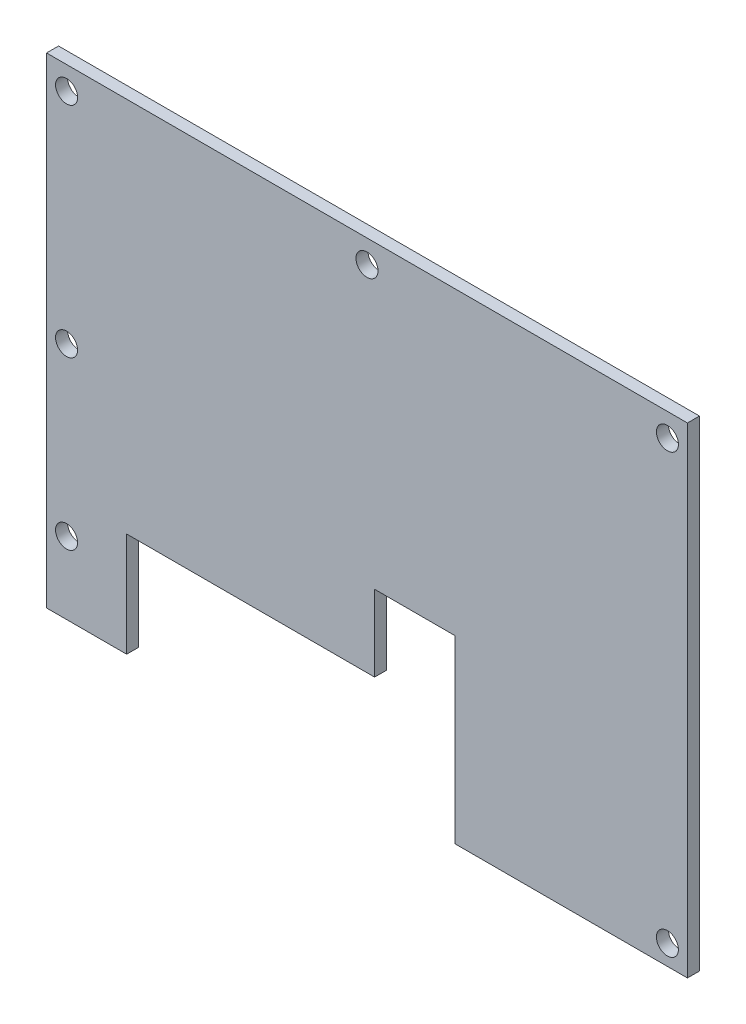
ISO-10303-21;
HEADER;
FILE_DESCRIPTION(('STEP AP214'),'2;1');
FILE_NAME('part.step','',(''),(''),'','','');
FILE_SCHEMA(('AUTOMOTIVE_DESIGN { 1 0 10303 214 1 1 1 1 }'));
ENDSEC;
DATA;
#1=APPLICATION_CONTEXT('core data for automotive mechanical design processes');
#2=APPLICATION_PROTOCOL_DEFINITION('international standard','automotive_design',2000,#1);
#3=PRODUCT_CONTEXT('',#1,'mechanical');
#4=PRODUCT('Part','Part','',(#3));
#5=PRODUCT_RELATED_PRODUCT_CATEGORY('part','',(#4));
#6=PRODUCT_DEFINITION_FORMATION('','',#4);
#7=PRODUCT_DEFINITION_CONTEXT('part definition',#1,'design');
#8=PRODUCT_DEFINITION('design','',#6,#7);
#9=PRODUCT_DEFINITION_SHAPE('','',#8);
#10=(LENGTH_UNIT() NAMED_UNIT(*) SI_UNIT(.MILLI.,.METRE.));
#11=(NAMED_UNIT(*) PLANE_ANGLE_UNIT() SI_UNIT($,.RADIAN.));
#12=(NAMED_UNIT(*) SI_UNIT($,.STERADIAN.) SOLID_ANGLE_UNIT());
#13=UNCERTAINTY_MEASURE_WITH_UNIT(LENGTH_MEASURE(1.E-05),#10,'distance_accuracy_value','');
#14=(GEOMETRIC_REPRESENTATION_CONTEXT(3) GLOBAL_UNCERTAINTY_ASSIGNED_CONTEXT((#13)) GLOBAL_UNIT_ASSIGNED_CONTEXT((#10,
#11,#12)) REPRESENTATION_CONTEXT('',''));
#15=CARTESIAN_POINT('',(0.,0.,0.));
#16=DIRECTION('',(0.,0.,1.));
#17=DIRECTION('',(1.,0.,0.));
#18=AXIS2_PLACEMENT_3D('',#15,#16,#17);
#19=CARTESIAN_POINT('',(0.,0.,0.));
#20=DIRECTION('',(0.,0.,-1.));
#21=DIRECTION('',(-1.,0.,0.));
#22=AXIS2_PLACEMENT_3D('',#19,#20,#21);
#23=PLANE('',#22);
#24=CARTESIAN_POINT('',(5.00000000000001,18.,0.));
#25=DIRECTION('',(0.,0.,1.));
#26=DIRECTION('',(1.,0.,0.));
#27=AXIS2_PLACEMENT_3D('',#24,#25,#26);
#28=CIRCLE('',#27,2.75);
#29=CARTESIAN_POINT('',(7.75000000000001,18.,0.));
#30=VERTEX_POINT('',#29);
#31=EDGE_CURVE('E145',#30,#30,#28,.T.);
#32=ORIENTED_EDGE('',*,*,#31,.T.);
#33=EDGE_LOOP('',(#32));
#34=FACE_BOUND('',#33,.T.);
#35=DIRECTION('',(-1.,0.,0.));
#36=VECTOR('',#35,1.);
#37=CARTESIAN_POINT('',(0.,26.,0.));
#38=LINE('',#37,#36);
#39=CARTESIAN_POINT('',(81.9,26.,0.));
#40=VERTEX_POINT('',#39);
#41=CARTESIAN_POINT('',(20.,26.,0.));
#42=VERTEX_POINT('',#41);
#43=EDGE_CURVE('E47',#40,#42,#38,.T.);
#44=ORIENTED_EDGE('',*,*,#43,.T.);
#45=DIRECTION('',(0.,-1.,0.));
#46=VECTOR('',#45,1.);
#47=CARTESIAN_POINT('',(20.,0.,0.));
#48=LINE('',#47,#46);
#49=CARTESIAN_POINT('',(20.,0.,0.));
#50=VERTEX_POINT('',#49);
#51=EDGE_CURVE('E11',#42,#50,#48,.T.);
#52=ORIENTED_EDGE('',*,*,#51,.T.);
#53=DIRECTION('',(1.,0.,0.));
#54=VECTOR('',#53,1.);
#55=CARTESIAN_POINT('',(0.,0.,0.));
#56=LINE('',#55,#54);
#57=CARTESIAN_POINT('',(0.,0.,0.));
#58=VERTEX_POINT('',#57);
#59=EDGE_CURVE('E164',#58,#50,#56,.T.);
#60=ORIENTED_EDGE('',*,*,#59,.F.);
#61=DIRECTION('',(0.,-1.,0.));
#62=VECTOR('',#61,1.);
#63=CARTESIAN_POINT('',(0.,0.,0.));
#64=LINE('',#63,#62);
#65=CARTESIAN_POINT('',(0.,120.,0.));
#66=VERTEX_POINT('',#65);
#67=EDGE_CURVE('E159',#66,#58,#64,.T.);
#68=ORIENTED_EDGE('',*,*,#67,.F.);
#69=DIRECTION('',(-1.,0.,0.));
#70=VECTOR('',#69,1.);
#71=CARTESIAN_POINT('',(0.,120.,0.));
#72=LINE('',#71,#70);
#73=CARTESIAN_POINT('',(160.,120.,0.));
#74=VERTEX_POINT('',#73);
#75=EDGE_CURVE('E84',#74,#66,#72,.T.);
#76=ORIENTED_EDGE('',*,*,#75,.F.);
#77=DIRECTION('',(0.,1.,0.));
#78=VECTOR('',#77,1.);
#79=CARTESIAN_POINT('',(160.,0.,0.));
#80=LINE('',#79,#78);
#81=CARTESIAN_POINT('',(160.,0.,0.));
#82=VERTEX_POINT('',#81);
#83=EDGE_CURVE('E167',#82,#74,#80,.T.);
#84=ORIENTED_EDGE('',*,*,#83,.F.);
#85=CARTESIAN_POINT('',(102.,0.,0.));
#86=VERTEX_POINT('',#85);
#87=EDGE_CURVE('E162',#86,#82,#56,.T.);
#88=ORIENTED_EDGE('',*,*,#87,.F.);
#89=DIRECTION('',(0.,-1.,0.));
#90=VECTOR('',#89,1.);
#91=CARTESIAN_POINT('',(102.,0.,0.));
#92=LINE('',#91,#90);
#93=CARTESIAN_POINT('',(102.,45.,0.));
#94=VERTEX_POINT('',#93);
#95=EDGE_CURVE('E131',#94,#86,#92,.T.);
#96=ORIENTED_EDGE('',*,*,#95,.F.);
#97=DIRECTION('',(-1.,0.,0.));
#98=VECTOR('',#97,1.);
#99=CARTESIAN_POINT('',(0.,45.,0.));
#100=LINE('',#99,#98);
#101=CARTESIAN_POINT('',(81.9,45.,0.));
#102=VERTEX_POINT('',#101);
#103=EDGE_CURVE('E177',#94,#102,#100,.T.);
#104=ORIENTED_EDGE('',*,*,#103,.T.);
#105=DIRECTION('',(0.,-1.,0.));
#106=VECTOR('',#105,1.);
#107=CARTESIAN_POINT('',(81.9,0.,0.));
#108=LINE('',#107,#106);
#109=EDGE_CURVE('E180',#102,#40,#108,.T.);
#110=ORIENTED_EDGE('',*,*,#109,.T.);
#111=EDGE_LOOP('',(#44,#52,#60,#68,#76,#84,#88,#96,#104,#110));
#112=FACE_BOUND('',#111,.T.);
#113=CARTESIAN_POINT('',(5.00000000000001,59.615,0.));
#114=DIRECTION('',(0.,0.,1.));
#115=DIRECTION('',(1.,0.,0.));
#116=AXIS2_PLACEMENT_3D('',#113,#114,#115);
#117=CIRCLE('',#116,2.75);
#118=CARTESIAN_POINT('',(7.75000000000001,59.615,0.));
#119=VERTEX_POINT('',#118);
#120=EDGE_CURVE('E406',#119,#119,#117,.T.);
#121=ORIENTED_EDGE('',*,*,#120,.T.);
#122=EDGE_LOOP('',(#121));
#123=FACE_BOUND('',#122,.T.);
#124=CARTESIAN_POINT('',(80.,114.23,0.));
#125=DIRECTION('',(0.,0.,1.));
#126=DIRECTION('',(1.,0.,0.));
#127=AXIS2_PLACEMENT_3D('',#124,#125,#126);
#128=CIRCLE('',#127,2.75);
#129=CARTESIAN_POINT('',(82.75,114.23,0.));
#130=VERTEX_POINT('',#129);
#131=EDGE_CURVE('E400',#130,#130,#128,.T.);
#132=ORIENTED_EDGE('',*,*,#131,.T.);
#133=EDGE_LOOP('',(#132));
#134=FACE_BOUND('',#133,.T.);
#135=CARTESIAN_POINT('',(155.,114.23,0.));
#136=DIRECTION('',(0.,0.,1.));
#137=DIRECTION('',(1.,0.,0.));
#138=AXIS2_PLACEMENT_3D('',#135,#136,#137);
#139=CIRCLE('',#138,2.75);
#140=CARTESIAN_POINT('',(157.75,114.23,0.));
#141=VERTEX_POINT('',#140);
#142=EDGE_CURVE('E394',#141,#141,#139,.T.);
#143=ORIENTED_EDGE('',*,*,#142,.T.);
#144=EDGE_LOOP('',(#143));
#145=FACE_BOUND('',#144,.T.);
#146=CARTESIAN_POINT('',(155.,5.,0.));
#147=DIRECTION('',(0.,0.,1.));
#148=DIRECTION('',(1.,0.,0.));
#149=AXIS2_PLACEMENT_3D('',#146,#147,#148);
#150=CIRCLE('',#149,2.75);
#151=CARTESIAN_POINT('',(157.75,5.,0.));
#152=VERTEX_POINT('',#151);
#153=EDGE_CURVE('E388',#152,#152,#150,.T.);
#154=ORIENTED_EDGE('',*,*,#153,.T.);
#155=EDGE_LOOP('',(#154));
#156=FACE_BOUND('',#155,.T.);
#157=CARTESIAN_POINT('',(5.,114.23,0.));
#158=DIRECTION('',(0.,0.,1.));
#159=DIRECTION('',(1.,0.,0.));
#160=AXIS2_PLACEMENT_3D('',#157,#158,#159);
#161=CIRCLE('',#160,2.75);
#162=CARTESIAN_POINT('',(7.75,114.23,0.));
#163=VERTEX_POINT('',#162);
#164=EDGE_CURVE('E378',#163,#163,#161,.T.);
#165=ORIENTED_EDGE('',*,*,#164,.T.);
#166=EDGE_LOOP('',(#165));
#167=FACE_BOUND('',#166,.T.);
#168=ADVANCED_FACE('F39',(#34,#112,#123,#134,#145,#156,#167),#23,.T.);
#169=CARTESIAN_POINT('',(0.,0.,3.));
#170=DIRECTION('',(0.,0.,-1.));
#171=DIRECTION('',(-1.,0.,0.));
#172=AXIS2_PLACEMENT_3D('',#169,#170,#171);
#173=PLANE('',#172);
#174=CARTESIAN_POINT('',(5.,114.23,3.));
#175=DIRECTION('',(0.,0.,1.));
#176=DIRECTION('',(1.,0.,0.));
#177=AXIS2_PLACEMENT_3D('',#174,#175,#176);
#178=CIRCLE('',#177,2.75);
#179=CARTESIAN_POINT('',(7.75,114.23,3.));
#180=VERTEX_POINT('',#179);
#181=EDGE_CURVE('E381',#180,#180,#178,.T.);
#182=ORIENTED_EDGE('',*,*,#181,.F.);
#183=EDGE_LOOP('',(#182));
#184=FACE_BOUND('',#183,.T.);
#185=CARTESIAN_POINT('',(155.,5.,3.));
#186=DIRECTION('',(0.,0.,1.));
#187=DIRECTION('',(1.,0.,0.));
#188=AXIS2_PLACEMENT_3D('',#185,#186,#187);
#189=CIRCLE('',#188,2.75);
#190=CARTESIAN_POINT('',(157.75,5.,3.));
#191=VERTEX_POINT('',#190);
#192=EDGE_CURVE('E383',#191,#191,#189,.T.);
#193=ORIENTED_EDGE('',*,*,#192,.F.);
#194=EDGE_LOOP('',(#193));
#195=FACE_BOUND('',#194,.T.);
#196=CARTESIAN_POINT('',(155.,114.23,3.));
#197=DIRECTION('',(0.,0.,1.));
#198=DIRECTION('',(1.,0.,0.));
#199=AXIS2_PLACEMENT_3D('',#196,#197,#198);
#200=CIRCLE('',#199,2.75);
#201=CARTESIAN_POINT('',(157.75,114.23,3.));
#202=VERTEX_POINT('',#201);
#203=EDGE_CURVE('E391',#202,#202,#200,.T.);
#204=ORIENTED_EDGE('',*,*,#203,.F.);
#205=EDGE_LOOP('',(#204));
#206=FACE_BOUND('',#205,.T.);
#207=CARTESIAN_POINT('',(80.,114.23,3.));
#208=DIRECTION('',(0.,0.,1.));
#209=DIRECTION('',(1.,0.,0.));
#210=AXIS2_PLACEMENT_3D('',#207,#208,#209);
#211=CIRCLE('',#210,2.75);
#212=CARTESIAN_POINT('',(82.75,114.23,3.));
#213=VERTEX_POINT('',#212);
#214=EDGE_CURVE('E397',#213,#213,#211,.T.);
#215=ORIENTED_EDGE('',*,*,#214,.F.);
#216=EDGE_LOOP('',(#215));
#217=FACE_BOUND('',#216,.T.);
#218=CARTESIAN_POINT('',(5.00000000000001,59.615,3.));
#219=DIRECTION('',(0.,0.,1.));
#220=DIRECTION('',(1.,0.,0.));
#221=AXIS2_PLACEMENT_3D('',#218,#219,#220);
#222=CIRCLE('',#221,2.75);
#223=CARTESIAN_POINT('',(7.75000000000001,59.615,3.));
#224=VERTEX_POINT('',#223);
#225=EDGE_CURVE('E403',#224,#224,#222,.T.);
#226=ORIENTED_EDGE('',*,*,#225,.F.);
#227=EDGE_LOOP('',(#226));
#228=FACE_BOUND('',#227,.T.);
#229=DIRECTION('',(0.,1.,0.));
#230=VECTOR('',#229,1.);
#231=CARTESIAN_POINT('',(20.,0.,3.));
#232=LINE('',#231,#230);
#233=CARTESIAN_POINT('',(20.,0.,3.));
#234=VERTEX_POINT('',#233);
#235=CARTESIAN_POINT('',(20.,26.,3.));
#236=VERTEX_POINT('',#235);
#237=EDGE_CURVE('E135',#234,#236,#232,.T.);
#238=ORIENTED_EDGE('',*,*,#237,.T.);
#239=DIRECTION('',(1.,0.,0.));
#240=VECTOR('',#239,1.);
#241=CARTESIAN_POINT('',(0.,26.,3.));
#242=LINE('',#241,#240);
#243=CARTESIAN_POINT('',(81.9,26.,3.));
#244=VERTEX_POINT('',#243);
#245=EDGE_CURVE('E215',#236,#244,#242,.T.);
#246=ORIENTED_EDGE('',*,*,#245,.T.);
#247=DIRECTION('',(0.,1.,0.));
#248=VECTOR('',#247,1.);
#249=CARTESIAN_POINT('',(81.9,0.,3.));
#250=LINE('',#249,#248);
#251=CARTESIAN_POINT('',(81.9,45.,3.));
#252=VERTEX_POINT('',#251);
#253=EDGE_CURVE('E196',#244,#252,#250,.T.);
#254=ORIENTED_EDGE('',*,*,#253,.T.);
#255=DIRECTION('',(1.,0.,0.));
#256=VECTOR('',#255,1.);
#257=CARTESIAN_POINT('',(0.,45.,3.));
#258=LINE('',#257,#256);
#259=CARTESIAN_POINT('',(102.,45.,3.));
#260=VERTEX_POINT('',#259);
#261=EDGE_CURVE('E144',#252,#260,#258,.T.);
#262=ORIENTED_EDGE('',*,*,#261,.T.);
#263=DIRECTION('',(0.,1.,0.));
#264=VECTOR('',#263,1.);
#265=CARTESIAN_POINT('',(102.,0.,3.));
#266=LINE('',#265,#264);
#267=CARTESIAN_POINT('',(102.,0.,3.));
#268=VERTEX_POINT('',#267);
#269=EDGE_CURVE('E128',#268,#260,#266,.T.);
#270=ORIENTED_EDGE('',*,*,#269,.F.);
#271=DIRECTION('',(1.,0.,0.));
#272=VECTOR('',#271,1.);
#273=CARTESIAN_POINT('',(0.,0.,3.));
#274=LINE('',#273,#272);
#275=CARTESIAN_POINT('',(160.,0.,3.));
#276=VERTEX_POINT('',#275);
#277=EDGE_CURVE('E140',#268,#276,#274,.T.);
#278=ORIENTED_EDGE('',*,*,#277,.T.);
#279=DIRECTION('',(0.,1.,0.));
#280=VECTOR('',#279,1.);
#281=CARTESIAN_POINT('',(160.,0.,3.));
#282=LINE('',#281,#280);
#283=CARTESIAN_POINT('',(160.,120.,3.));
#284=VERTEX_POINT('',#283);
#285=EDGE_CURVE('E153',#276,#284,#282,.T.);
#286=ORIENTED_EDGE('',*,*,#285,.T.);
#287=DIRECTION('',(-1.,0.,0.));
#288=VECTOR('',#287,1.);
#289=CARTESIAN_POINT('',(0.,120.,3.));
#290=LINE('',#289,#288);
#291=CARTESIAN_POINT('',(0.,120.,3.));
#292=VERTEX_POINT('',#291);
#293=EDGE_CURVE('E63',#284,#292,#290,.T.);
#294=ORIENTED_EDGE('',*,*,#293,.T.);
#295=DIRECTION('',(0.,-1.,0.));
#296=VECTOR('',#295,1.);
#297=CARTESIAN_POINT('',(0.,0.,3.));
#298=LINE('',#297,#296);
#299=CARTESIAN_POINT('',(0.,0.,3.));
#300=VERTEX_POINT('',#299);
#301=EDGE_CURVE('E151',#292,#300,#298,.T.);
#302=ORIENTED_EDGE('',*,*,#301,.T.);
#303=EDGE_CURVE('E92',#300,#234,#274,.T.);
#304=ORIENTED_EDGE('',*,*,#303,.T.);
#305=EDGE_LOOP('',(#238,#246,#254,#262,#270,#278,#286,#294,#302,#304));
#306=FACE_BOUND('',#305,.T.);
#307=CARTESIAN_POINT('',(5.00000000000001,18.,3.));
#308=DIRECTION('',(0.,0.,1.));
#309=DIRECTION('',(1.,0.,0.));
#310=AXIS2_PLACEMENT_3D('',#307,#308,#309);
#311=CIRCLE('',#310,2.75);
#312=CARTESIAN_POINT('',(7.75000000000001,18.,3.));
#313=VERTEX_POINT('',#312);
#314=EDGE_CURVE('E409',#313,#313,#311,.T.);
#315=ORIENTED_EDGE('',*,*,#314,.F.);
#316=EDGE_LOOP('',(#315));
#317=FACE_BOUND('',#316,.T.);
#318=ADVANCED_FACE('F138',(#184,#195,#206,#217,#228,#306,#317),#173,.F.);
#319=CARTESIAN_POINT('',(0.,0.,3.));
#320=DIRECTION('',(0.,1.,0.));
#321=DIRECTION('',(0.,0.,1.));
#322=AXIS2_PLACEMENT_3D('',#319,#320,#321);
#323=PLANE('',#322);
#324=DIRECTION('',(0.,0.,1.));
#325=VECTOR('',#324,1.);
#326=CARTESIAN_POINT('',(20.,0.,-7.));
#327=LINE('',#326,#325);
#328=EDGE_CURVE('E163',#50,#234,#327,.T.);
#329=ORIENTED_EDGE('',*,*,#328,.T.);
#330=ORIENTED_EDGE('',*,*,#303,.F.);
#331=DIRECTION('',(0.,0.,-1.));
#332=VECTOR('',#331,1.);
#333=CARTESIAN_POINT('',(0.,0.,3.));
#334=LINE('',#333,#332);
#335=EDGE_CURVE('E174',#300,#58,#334,.T.);
#336=ORIENTED_EDGE('',*,*,#335,.T.);
#337=ORIENTED_EDGE('',*,*,#59,.T.);
#338=EDGE_LOOP('',(#329,#330,#336,#337));
#339=FACE_BOUND('',#338,.T.);
#340=ADVANCED_FACE('F220',(#339),#323,.F.);
#341=CARTESIAN_POINT('',(0.,0.,3.));
#342=DIRECTION('',(1.,0.,0.));
#343=DIRECTION('',(0.,0.,-1.));
#344=AXIS2_PLACEMENT_3D('',#341,#342,#343);
#345=PLANE('',#344);
#346=ORIENTED_EDGE('',*,*,#67,.T.);
#347=ORIENTED_EDGE('',*,*,#335,.F.);
#348=ORIENTED_EDGE('',*,*,#301,.F.);
#349=DIRECTION('',(0.,0.,-1.));
#350=VECTOR('',#349,1.);
#351=CARTESIAN_POINT('',(0.,120.,3.));
#352=LINE('',#351,#350);
#353=EDGE_CURVE('E158',#292,#66,#352,.T.);
#354=ORIENTED_EDGE('',*,*,#353,.T.);
#355=EDGE_LOOP('',(#346,#347,#348,#354));
#356=FACE_BOUND('',#355,.T.);
#357=ADVANCED_FACE('F41',(#356),#345,.F.);
#358=ORIENTED_EDGE('',*,*,#277,.F.);
#359=DIRECTION('',(0.,0.,1.));
#360=VECTOR('',#359,1.);
#361=CARTESIAN_POINT('',(102.,0.,-7.));
#362=LINE('',#361,#360);
#363=EDGE_CURVE('E125',#86,#268,#362,.T.);
#364=ORIENTED_EDGE('',*,*,#363,.F.);
#365=ORIENTED_EDGE('',*,*,#87,.T.);
#366=DIRECTION('',(0.,0.,-1.));
#367=VECTOR('',#366,1.);
#368=CARTESIAN_POINT('',(160.,0.,3.));
#369=LINE('',#368,#367);
#370=EDGE_CURVE('E149',#276,#82,#369,.T.);
#371=ORIENTED_EDGE('',*,*,#370,.F.);
#372=EDGE_LOOP('',(#358,#364,#365,#371));
#373=FACE_BOUND('',#372,.T.);
#374=ADVANCED_FACE('F147',(#373),#323,.F.);
#375=CARTESIAN_POINT('',(160.,0.,3.));
#376=DIRECTION('',(-1.,0.,0.));
#377=DIRECTION('',(0.,0.,1.));
#378=AXIS2_PLACEMENT_3D('',#375,#376,#377);
#379=PLANE('',#378);
#380=ORIENTED_EDGE('',*,*,#83,.T.);
#381=DIRECTION('',(0.,0.,-1.));
#382=VECTOR('',#381,1.);
#383=CARTESIAN_POINT('',(160.,120.,3.));
#384=LINE('',#383,#382);
#385=EDGE_CURVE('E171',#284,#74,#384,.T.);
#386=ORIENTED_EDGE('',*,*,#385,.F.);
#387=ORIENTED_EDGE('',*,*,#285,.F.);
#388=ORIENTED_EDGE('',*,*,#370,.T.);
#389=EDGE_LOOP('',(#380,#386,#387,#388));
#390=FACE_BOUND('',#389,.T.);
#391=ADVANCED_FACE('F208',(#390),#379,.F.);
#392=CARTESIAN_POINT('',(0.,120.,3.));
#393=DIRECTION('',(0.,-1.,0.));
#394=DIRECTION('',(0.,0.,-1.));
#395=AXIS2_PLACEMENT_3D('',#392,#393,#394);
#396=PLANE('',#395);
#397=ORIENTED_EDGE('',*,*,#75,.T.);
#398=ORIENTED_EDGE('',*,*,#353,.F.);
#399=ORIENTED_EDGE('',*,*,#293,.F.);
#400=ORIENTED_EDGE('',*,*,#385,.T.);
#401=EDGE_LOOP('',(#397,#398,#399,#400));
#402=FACE_BOUND('',#401,.T.);
#403=ADVANCED_FACE('F210',(#402),#396,.F.);
#404=CARTESIAN_POINT('',(20.,0.,-7.));
#405=DIRECTION('',(1.,0.,0.));
#406=DIRECTION('',(0.,1.,0.));
#407=AXIS2_PLACEMENT_3D('',#404,#405,#406);
#408=PLANE('',#407);
#409=DIRECTION('',(0.,0.,1.));
#410=VECTOR('',#409,1.);
#411=CARTESIAN_POINT('',(20.,26.,-7.));
#412=LINE('',#411,#410);
#413=EDGE_CURVE('E192',#42,#236,#412,.T.);
#414=ORIENTED_EDGE('',*,*,#413,.T.);
#415=ORIENTED_EDGE('',*,*,#237,.F.);
#416=ORIENTED_EDGE('',*,*,#328,.F.);
#417=ORIENTED_EDGE('',*,*,#51,.F.);
#418=EDGE_LOOP('',(#414,#415,#416,#417));
#419=FACE_BOUND('',#418,.T.);
#420=ADVANCED_FACE('F221',(#419),#408,.T.);
#421=CARTESIAN_POINT('',(0.,26.,-7.));
#422=DIRECTION('',(0.,-1.,0.));
#423=DIRECTION('',(0.,0.,-1.));
#424=AXIS2_PLACEMENT_3D('',#421,#422,#423);
#425=PLANE('',#424);
#426=DIRECTION('',(0.,0.,1.));
#427=VECTOR('',#426,1.);
#428=CARTESIAN_POINT('',(81.9,26.,-7.));
#429=LINE('',#428,#427);
#430=EDGE_CURVE('E190',#40,#244,#429,.T.);
#431=ORIENTED_EDGE('',*,*,#430,.T.);
#432=ORIENTED_EDGE('',*,*,#245,.F.);
#433=ORIENTED_EDGE('',*,*,#413,.F.);
#434=ORIENTED_EDGE('',*,*,#43,.F.);
#435=EDGE_LOOP('',(#431,#432,#433,#434));
#436=FACE_BOUND('',#435,.T.);
#437=ADVANCED_FACE('F188',(#436),#425,.T.);
#438=CARTESIAN_POINT('',(81.9,0.,-7.));
#439=DIRECTION('',(1.,0.,0.));
#440=DIRECTION('',(0.,0.,-1.));
#441=AXIS2_PLACEMENT_3D('',#438,#439,#440);
#442=PLANE('',#441);
#443=DIRECTION('',(0.,0.,1.));
#444=VECTOR('',#443,1.);
#445=CARTESIAN_POINT('',(81.9,45.,-7.));
#446=LINE('',#445,#444);
#447=EDGE_CURVE('E198',#102,#252,#446,.T.);
#448=ORIENTED_EDGE('',*,*,#447,.T.);
#449=ORIENTED_EDGE('',*,*,#253,.F.);
#450=ORIENTED_EDGE('',*,*,#430,.F.);
#451=ORIENTED_EDGE('',*,*,#109,.F.);
#452=EDGE_LOOP('',(#448,#449,#450,#451));
#453=FACE_BOUND('',#452,.T.);
#454=ADVANCED_FACE('F194',(#453),#442,.T.);
#455=CARTESIAN_POINT('',(0.,45.,-7.));
#456=DIRECTION('',(0.,-1.,0.));
#457=DIRECTION('',(0.,0.,-1.));
#458=AXIS2_PLACEMENT_3D('',#455,#456,#457);
#459=PLANE('',#458);
#460=DIRECTION('',(0.,0.,1.));
#461=VECTOR('',#460,1.);
#462=CARTESIAN_POINT('',(102.,45.,-7.));
#463=LINE('',#462,#461);
#464=EDGE_CURVE('E54',#94,#260,#463,.T.);
#465=ORIENTED_EDGE('',*,*,#464,.T.);
#466=ORIENTED_EDGE('',*,*,#261,.F.);
#467=ORIENTED_EDGE('',*,*,#447,.F.);
#468=ORIENTED_EDGE('',*,*,#103,.F.);
#469=EDGE_LOOP('',(#465,#466,#467,#468));
#470=FACE_BOUND('',#469,.T.);
#471=ADVANCED_FACE('F205',(#470),#459,.T.);
#472=CARTESIAN_POINT('',(102.,0.,-7.));
#473=DIRECTION('',(1.,0.,0.));
#474=DIRECTION('',(0.,0.,-1.));
#475=AXIS2_PLACEMENT_3D('',#472,#473,#474);
#476=PLANE('',#475);
#477=ORIENTED_EDGE('',*,*,#95,.T.);
#478=ORIENTED_EDGE('',*,*,#363,.T.);
#479=ORIENTED_EDGE('',*,*,#269,.T.);
#480=ORIENTED_EDGE('',*,*,#464,.F.);
#481=EDGE_LOOP('',(#477,#478,#479,#480));
#482=FACE_BOUND('',#481,.T.);
#483=ADVANCED_FACE('F127',(#482),#476,.F.);
#484=CARTESIAN_POINT('',(5.00000000000001,18.,3.));
#485=DIRECTION('',(0.,0.,1.));
#486=DIRECTION('',(1.,0.,0.));
#487=AXIS2_PLACEMENT_3D('',#484,#485,#486);
#488=CYLINDRICAL_SURFACE('',#487,2.75);
#489=ORIENTED_EDGE('',*,*,#31,.F.);
#490=EDGE_LOOP('',(#489));
#491=FACE_BOUND('',#490,.T.);
#492=ORIENTED_EDGE('',*,*,#314,.T.);
#493=EDGE_LOOP('',(#492));
#494=FACE_BOUND('',#493,.T.);
#495=ADVANCED_FACE('F305',(#491,#494),#488,.F.);
#496=CARTESIAN_POINT('',(5.00000000000001,59.615,3.));
#497=DIRECTION('',(0.,0.,1.));
#498=DIRECTION('',(1.,0.,0.));
#499=AXIS2_PLACEMENT_3D('',#496,#497,#498);
#500=CYLINDRICAL_SURFACE('',#499,2.75);
#501=ORIENTED_EDGE('',*,*,#120,.F.);
#502=EDGE_LOOP('',(#501));
#503=FACE_BOUND('',#502,.T.);
#504=ORIENTED_EDGE('',*,*,#225,.T.);
#505=EDGE_LOOP('',(#504));
#506=FACE_BOUND('',#505,.T.);
#507=ADVANCED_FACE('F321',(#503,#506),#500,.F.);
#508=CARTESIAN_POINT('',(80.,114.23,3.));
#509=DIRECTION('',(0.,0.,1.));
#510=DIRECTION('',(1.,0.,0.));
#511=AXIS2_PLACEMENT_3D('',#508,#509,#510);
#512=CYLINDRICAL_SURFACE('',#511,2.75);
#513=ORIENTED_EDGE('',*,*,#131,.F.);
#514=EDGE_LOOP('',(#513));
#515=FACE_BOUND('',#514,.T.);
#516=ORIENTED_EDGE('',*,*,#214,.T.);
#517=EDGE_LOOP('',(#516));
#518=FACE_BOUND('',#517,.T.);
#519=ADVANCED_FACE('F329',(#515,#518),#512,.F.);
#520=CARTESIAN_POINT('',(155.,114.23,3.));
#521=DIRECTION('',(0.,0.,1.));
#522=DIRECTION('',(1.,0.,0.));
#523=AXIS2_PLACEMENT_3D('',#520,#521,#522);
#524=CYLINDRICAL_SURFACE('',#523,2.75);
#525=ORIENTED_EDGE('',*,*,#142,.F.);
#526=EDGE_LOOP('',(#525));
#527=FACE_BOUND('',#526,.T.);
#528=ORIENTED_EDGE('',*,*,#203,.T.);
#529=EDGE_LOOP('',(#528));
#530=FACE_BOUND('',#529,.T.);
#531=ADVANCED_FACE('F338',(#527,#530),#524,.F.);
#532=CARTESIAN_POINT('',(155.,5.,3.));
#533=DIRECTION('',(0.,0.,1.));
#534=DIRECTION('',(1.,0.,0.));
#535=AXIS2_PLACEMENT_3D('',#532,#533,#534);
#536=CYLINDRICAL_SURFACE('',#535,2.75);
#537=ORIENTED_EDGE('',*,*,#153,.F.);
#538=EDGE_LOOP('',(#537));
#539=FACE_BOUND('',#538,.T.);
#540=ORIENTED_EDGE('',*,*,#192,.T.);
#541=EDGE_LOOP('',(#540));
#542=FACE_BOUND('',#541,.T.);
#543=ADVANCED_FACE('F347',(#539,#542),#536,.F.);
#544=CARTESIAN_POINT('',(5.,114.23,3.));
#545=DIRECTION('',(0.,0.,1.));
#546=DIRECTION('',(1.,0.,0.));
#547=AXIS2_PLACEMENT_3D('',#544,#545,#546);
#548=CYLINDRICAL_SURFACE('',#547,2.75);
#549=ORIENTED_EDGE('',*,*,#164,.F.);
#550=EDGE_LOOP('',(#549));
#551=FACE_BOUND('',#550,.T.);
#552=ORIENTED_EDGE('',*,*,#181,.T.);
#553=EDGE_LOOP('',(#552));
#554=FACE_BOUND('',#553,.T.);
#555=ADVANCED_FACE('F356',(#551,#554),#548,.F.);
#556=CLOSED_SHELL('',(#168,#318,#340,#357,#374,#391,#403,#420,#437,#454,#471,#483,#495,#507,
#519,#531,#543,#555));
#557=MANIFOLD_SOLID_BREP('B2',#556);
#558=ADVANCED_BREP_SHAPE_REPRESENTATION('',(#18,#557),#14);
#559=SHAPE_DEFINITION_REPRESENTATION(#9,#558);
ENDSEC;
END-ISO-10303-21;
